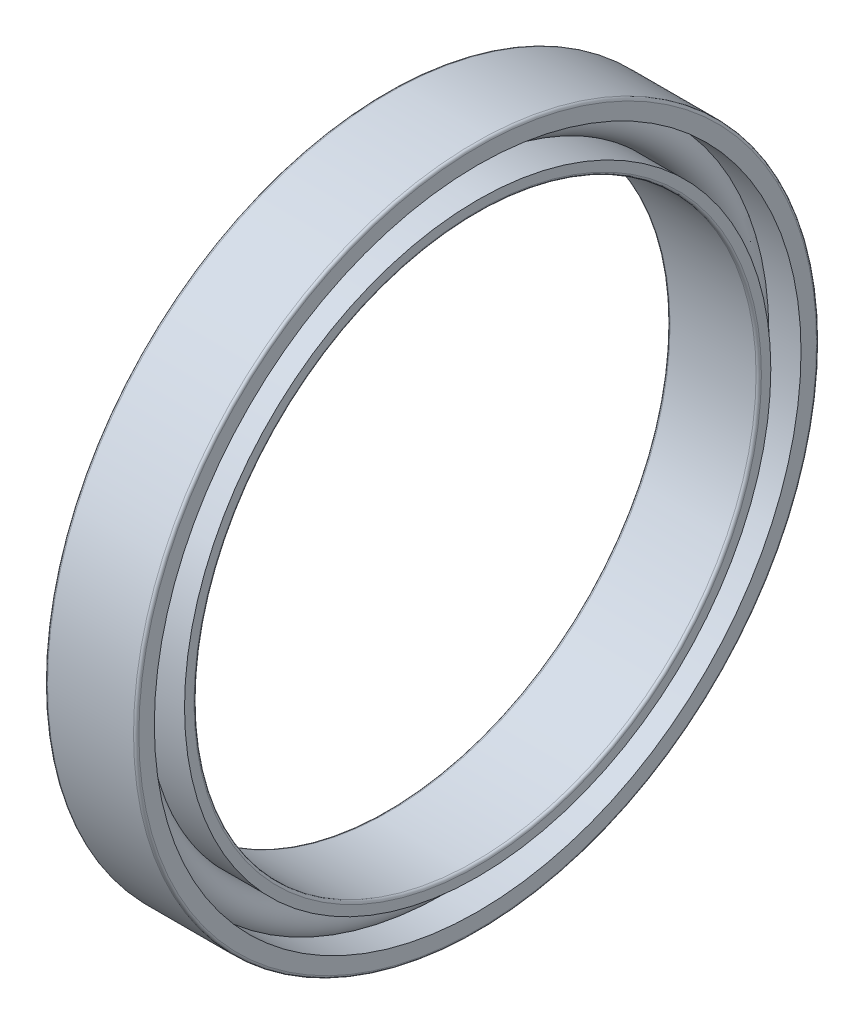
ISO-10303-21;
HEADER;
FILE_DESCRIPTION(('STEP AP214'),'2;1');
FILE_NAME('part.step','',(''),(''),'','','');
FILE_SCHEMA(('AUTOMOTIVE_DESIGN { 1 0 10303 214 1 1 1 1 }'));
ENDSEC;
DATA;
#1=APPLICATION_CONTEXT('core data for automotive mechanical design processes');
#2=APPLICATION_PROTOCOL_DEFINITION('international standard','automotive_design',2000,#1);
#3=PRODUCT_CONTEXT('',#1,'mechanical');
#4=PRODUCT('Part','Part','',(#3));
#5=PRODUCT_RELATED_PRODUCT_CATEGORY('part','',(#4));
#6=PRODUCT_DEFINITION_FORMATION('','',#4);
#7=PRODUCT_DEFINITION_CONTEXT('part definition',#1,'design');
#8=PRODUCT_DEFINITION('design','',#6,#7);
#9=PRODUCT_DEFINITION_SHAPE('','',#8);
#10=(LENGTH_UNIT() NAMED_UNIT(*) SI_UNIT(.MILLI.,.METRE.));
#11=(NAMED_UNIT(*) PLANE_ANGLE_UNIT() SI_UNIT($,.RADIAN.));
#12=(NAMED_UNIT(*) SI_UNIT($,.STERADIAN.) SOLID_ANGLE_UNIT());
#13=UNCERTAINTY_MEASURE_WITH_UNIT(LENGTH_MEASURE(1.E-05),#10,'distance_accuracy_value','');
#14=(GEOMETRIC_REPRESENTATION_CONTEXT(3) GLOBAL_UNCERTAINTY_ASSIGNED_CONTEXT((#13)) GLOBAL_UNIT_ASSIGNED_CONTEXT((#10,
#11,#12)) REPRESENTATION_CONTEXT('',''));
#15=CARTESIAN_POINT('',(0.,0.,0.));
#16=DIRECTION('',(0.,0.,1.));
#17=DIRECTION('',(1.,0.,0.));
#18=AXIS2_PLACEMENT_3D('',#15,#16,#17);
#19=CARTESIAN_POINT('',(0.,0.,0.));
#20=DIRECTION('',(-1.,0.,0.));
#21=DIRECTION('',(0.,0.,1.));
#22=AXIS2_PLACEMENT_3D('',#19,#20,#21);
#23=TOROIDAL_SURFACE('',#22,1107.5,64.5);
#24=CARTESIAN_POINT('',(48.0754615162453,0.,0.));
#25=DIRECTION('',(-1.,0.,0.));
#26=DIRECTION('',(0.,0.,1.));
#27=AXIS2_PLACEMENT_3D('',#24,#25,#26);
#28=CIRCLE('',#27,1150.5);
#29=CARTESIAN_POINT('',(48.0754615162453,0.,1150.5));
#30=VERTEX_POINT('',#29);
#31=EDGE_CURVE('E45',#30,#30,#28,.F.);
#32=ORIENTED_EDGE('',*,*,#31,.T.);
#33=EDGE_LOOP('',(#32));
#34=FACE_BOUND('',#33,.T.);
#35=CARTESIAN_POINT('',(1.79565447679094,0.,0.));
#36=DIRECTION('',(-1.,0.,0.));
#37=DIRECTION('',(0.,0.,1.));
#38=AXIS2_PLACEMENT_3D('',#35,#36,#37);
#39=CIRCLE('',#38,1043.025);
#40=CARTESIAN_POINT('',(1.79565447679094,0.,1043.025));
#41=VERTEX_POINT('',#40);
#42=EDGE_CURVE('E10',#41,#41,#39,.T.);
#43=ORIENTED_EDGE('',*,*,#42,.T.);
#44=EDGE_LOOP('',(#43));
#45=FACE_BOUND('',#44,.T.);
#46=ADVANCED_FACE('F41',(#34,#45),#23,.T.);
#47=CARTESIAN_POINT('',(-20.6375,0.,0.));
#48=DIRECTION('',(1.,0.,0.));
#49=DIRECTION('',(0.,0.,-1.));
#50=AXIS2_PLACEMENT_3D('',#47,#48,#49);
#51=CYLINDRICAL_SURFACE('',#50,1043.025);
#52=CARTESIAN_POINT('',(162.5,0.,0.));
#53=DIRECTION('',(1.,0.,0.));
#54=DIRECTION('',(0.,0.,-1.));
#55=AXIS2_PLACEMENT_3D('',#52,#53,#54);
#56=CIRCLE('',#55,1043.025);
#57=CARTESIAN_POINT('',(162.5,0.,-1043.025));
#58=VERTEX_POINT('',#57);
#59=EDGE_CURVE('E56',#58,#58,#56,.T.);
#60=ORIENTED_EDGE('',*,*,#59,.F.);
#61=EDGE_LOOP('',(#60));
#62=FACE_BOUND('',#61,.T.);
#63=ORIENTED_EDGE('',*,*,#42,.F.);
#64=EDGE_LOOP('',(#63));
#65=FACE_BOUND('',#64,.T.);
#66=ADVANCED_FACE('F105',(#62,#65),#51,.T.);
#67=CARTESIAN_POINT('',(-20.6375,0.,0.));
#68=DIRECTION('',(1.,0.,0.));
#69=DIRECTION('',(0.,0.,-1.));
#70=AXIS2_PLACEMENT_3D('',#67,#68,#69);
#71=CYLINDRICAL_SURFACE('',#70,1064.5);
#72=CARTESIAN_POINT('',(-162.5,0.,0.));
#73=DIRECTION('',(1.,0.,0.));
#74=DIRECTION('',(0.,0.,-1.));
#75=AXIS2_PLACEMENT_3D('',#72,#73,#74);
#76=CIRCLE('',#75,1064.5);
#77=CARTESIAN_POINT('',(-162.5,0.,-1064.5));
#78=VERTEX_POINT('',#77);
#79=EDGE_CURVE('E68',#78,#78,#76,.T.);
#80=ORIENTED_EDGE('',*,*,#79,.T.);
#81=EDGE_LOOP('',(#80));
#82=FACE_BOUND('',#81,.T.);
#83=CARTESIAN_POINT('',(-48.0754615162457,0.,0.));
#84=DIRECTION('',(1.,0.,0.));
#85=DIRECTION('',(0.,0.,-1.));
#86=AXIS2_PLACEMENT_3D('',#83,#84,#85);
#87=CIRCLE('',#86,1064.5);
#88=CARTESIAN_POINT('',(-48.0754615162457,0.,-1064.5));
#89=VERTEX_POINT('',#88);
#90=EDGE_CURVE('E50',#89,#89,#87,.T.);
#91=ORIENTED_EDGE('',*,*,#90,.F.);
#92=EDGE_LOOP('',(#91));
#93=FACE_BOUND('',#92,.T.);
#94=ADVANCED_FACE('F108',(#82,#93),#71,.T.);
#95=CARTESIAN_POINT('',(162.5,1009.5,0.));
#96=DIRECTION('',(1.,0.,0.));
#97=DIRECTION('',(0.,0.,-1.));
#98=AXIS2_PLACEMENT_3D('',#95,#96,#97);
#99=PLANE('',#98);
#100=ORIENTED_EDGE('',*,*,#59,.T.);
#101=EDGE_LOOP('',(#100));
#102=FACE_BOUND('',#101,.T.);
#103=CARTESIAN_POINT('',(162.5,0.,0.));
#104=DIRECTION('',(1.,0.,0.));
#105=DIRECTION('',(0.,0.,-1.));
#106=AXIS2_PLACEMENT_3D('',#103,#104,#105);
#107=CIRCLE('',#106,1009.5);
#108=CARTESIAN_POINT('',(162.5,0.,-1009.5));
#109=VERTEX_POINT('',#108);
#110=EDGE_CURVE('E95',#109,#109,#107,.T.);
#111=ORIENTED_EDGE('',*,*,#110,.F.);
#112=EDGE_LOOP('',(#111));
#113=FACE_BOUND('',#112,.T.);
#114=ADVANCED_FACE('F102',(#102,#113),#99,.T.);
#115=CARTESIAN_POINT('',(153.,0.,0.));
#116=DIRECTION('',(1.,0.,0.));
#117=DIRECTION('',(0.,0.,-1.));
#118=AXIS2_PLACEMENT_3D('',#115,#116,#117);
#119=TOROIDAL_SURFACE('',#118,1009.5,9.50000000000005);
#120=ORIENTED_EDGE('',*,*,#110,.T.);
#121=EDGE_LOOP('',(#120));
#122=FACE_BOUND('',#121,.T.);
#123=CARTESIAN_POINT('',(153.,0.,0.));
#124=DIRECTION('',(1.,0.,0.));
#125=DIRECTION('',(0.,0.,-1.));
#126=AXIS2_PLACEMENT_3D('',#123,#124,#125);
#127=CIRCLE('',#126,1000.);
#128=CARTESIAN_POINT('',(153.,0.,-1000.));
#129=VERTEX_POINT('',#128);
#130=EDGE_CURVE('E91',#129,#129,#127,.T.);
#131=ORIENTED_EDGE('',*,*,#130,.F.);
#132=EDGE_LOOP('',(#131));
#133=FACE_BOUND('',#132,.T.);
#134=ADVANCED_FACE('F119',(#122,#133),#119,.T.);
#135=CARTESIAN_POINT('',(-20.6375,0.,0.));
#136=DIRECTION('',(1.,0.,0.));
#137=DIRECTION('',(0.,0.,-1.));
#138=AXIS2_PLACEMENT_3D('',#135,#136,#137);
#139=CYLINDRICAL_SURFACE('',#138,1000.);
#140=ORIENTED_EDGE('',*,*,#130,.T.);
#141=EDGE_LOOP('',(#140));
#142=FACE_BOUND('',#141,.T.);
#143=CARTESIAN_POINT('',(-153.,0.,0.));
#144=DIRECTION('',(1.,0.,0.));
#145=DIRECTION('',(0.,0.,-1.));
#146=AXIS2_PLACEMENT_3D('',#143,#144,#145);
#147=CIRCLE('',#146,1000.);
#148=CARTESIAN_POINT('',(-153.,0.,-1000.));
#149=VERTEX_POINT('',#148);
#150=EDGE_CURVE('E87',#149,#149,#147,.T.);
#151=ORIENTED_EDGE('',*,*,#150,.F.);
#152=EDGE_LOOP('',(#151));
#153=FACE_BOUND('',#152,.T.);
#154=ADVANCED_FACE('F122',(#142,#153),#139,.F.);
#155=CARTESIAN_POINT('',(-153.,0.,0.));
#156=DIRECTION('',(1.,0.,0.));
#157=DIRECTION('',(0.,0.,-1.));
#158=AXIS2_PLACEMENT_3D('',#155,#156,#157);
#159=TOROIDAL_SURFACE('',#158,1009.5,9.50000000000005);
#160=ORIENTED_EDGE('',*,*,#150,.T.);
#161=EDGE_LOOP('',(#160));
#162=FACE_BOUND('',#161,.T.);
#163=CARTESIAN_POINT('',(-162.5,0.,0.));
#164=DIRECTION('',(1.,0.,0.));
#165=DIRECTION('',(0.,0.,-1.));
#166=AXIS2_PLACEMENT_3D('',#163,#164,#165);
#167=CIRCLE('',#166,1009.5);
#168=CARTESIAN_POINT('',(-162.5,0.,-1009.5));
#169=VERTEX_POINT('',#168);
#170=EDGE_CURVE('E83',#169,#169,#167,.T.);
#171=ORIENTED_EDGE('',*,*,#170,.F.);
#172=EDGE_LOOP('',(#171));
#173=FACE_BOUND('',#172,.T.);
#174=ADVANCED_FACE('F126',(#162,#173),#159,.T.);
#175=CARTESIAN_POINT('',(-162.5,1064.5,0.));
#176=DIRECTION('',(-1.,0.,0.));
#177=DIRECTION('',(0.,0.,1.));
#178=AXIS2_PLACEMENT_3D('',#175,#176,#177);
#179=PLANE('',#178);
#180=ORIENTED_EDGE('',*,*,#170,.T.);
#181=EDGE_LOOP('',(#180));
#182=FACE_BOUND('',#181,.T.);
#183=ORIENTED_EDGE('',*,*,#79,.F.);
#184=EDGE_LOOP('',(#183));
#185=FACE_BOUND('',#184,.T.);
#186=ADVANCED_FACE('F130',(#182,#185),#179,.T.);
#187=CARTESIAN_POINT('',(-1.79565447679094,0.,0.));
#188=DIRECTION('',(1.,0.,0.));
#189=DIRECTION('',(0.,0.,-1.));
#190=AXIS2_PLACEMENT_3D('',#187,#188,#189);
#191=CIRCLE('',#190,1171.975);
#192=CARTESIAN_POINT('',(-1.79565447679094,0.,-1171.975));
#193=VERTEX_POINT('',#192);
#194=EDGE_CURVE('E59',#193,#193,#191,.F.);
#195=ORIENTED_EDGE('',*,*,#194,.T.);
#196=EDGE_LOOP('',(#195));
#197=FACE_BOUND('',#196,.T.);
#198=ORIENTED_EDGE('',*,*,#90,.T.);
#199=EDGE_LOOP('',(#198));
#200=FACE_BOUND('',#199,.T.);
#201=ADVANCED_FACE('F43',(#197,#200),#23,.T.);
#202=CARTESIAN_POINT('',(-20.6375,0.,0.));
#203=DIRECTION('',(1.,0.,0.));
#204=DIRECTION('',(0.,0.,-1.));
#205=AXIS2_PLACEMENT_3D('',#202,#203,#204);
#206=CYLINDRICAL_SURFACE('',#205,1150.5);
#207=CARTESIAN_POINT('',(162.5,0.,0.));
#208=DIRECTION('',(1.,0.,0.));
#209=DIRECTION('',(0.,0.,-1.));
#210=AXIS2_PLACEMENT_3D('',#207,#208,#209);
#211=CIRCLE('',#210,1150.5);
#212=CARTESIAN_POINT('',(162.5,0.,-1150.5));
#213=VERTEX_POINT('',#212);
#214=EDGE_CURVE('E173',#213,#213,#211,.T.);
#215=ORIENTED_EDGE('',*,*,#214,.T.);
#216=EDGE_LOOP('',(#215));
#217=FACE_BOUND('',#216,.T.);
#218=ORIENTED_EDGE('',*,*,#31,.F.);
#219=EDGE_LOOP('',(#218));
#220=FACE_BOUND('',#219,.T.);
#221=ADVANCED_FACE('F152',(#217,#220),#206,.F.);
#222=CARTESIAN_POINT('',(-20.6375,0.,0.));
#223=DIRECTION('',(1.,0.,0.));
#224=DIRECTION('',(0.,0.,-1.));
#225=AXIS2_PLACEMENT_3D('',#222,#223,#224);
#226=CYLINDRICAL_SURFACE('',#225,1171.975);
#227=CARTESIAN_POINT('',(-162.5,0.,0.));
#228=DIRECTION('',(1.,0.,0.));
#229=DIRECTION('',(0.,0.,-1.));
#230=AXIS2_PLACEMENT_3D('',#227,#228,#229);
#231=CIRCLE('',#230,1171.975);
#232=CARTESIAN_POINT('',(-162.5,0.,-1171.975));
#233=VERTEX_POINT('',#232);
#234=EDGE_CURVE('E166',#233,#233,#231,.T.);
#235=ORIENTED_EDGE('',*,*,#234,.F.);
#236=EDGE_LOOP('',(#235));
#237=FACE_BOUND('',#236,.T.);
#238=ORIENTED_EDGE('',*,*,#194,.F.);
#239=EDGE_LOOP('',(#238));
#240=FACE_BOUND('',#239,.T.);
#241=ADVANCED_FACE('F139',(#237,#240),#226,.F.);
#242=CARTESIAN_POINT('',(-153.,0.,0.));
#243=DIRECTION('',(1.,0.,0.));
#244=DIRECTION('',(0.,0.,-1.));
#245=AXIS2_PLACEMENT_3D('',#242,#243,#244);
#246=TOROIDAL_SURFACE('',#245,1205.5,9.49999999999981);
#247=CARTESIAN_POINT('',(-162.5,0.,0.));
#248=DIRECTION('',(1.,0.,0.));
#249=DIRECTION('',(0.,0.,-1.));
#250=AXIS2_PLACEMENT_3D('',#247,#248,#249);
#251=CIRCLE('',#250,1205.5);
#252=CARTESIAN_POINT('',(-162.5,0.,-1205.5));
#253=VERTEX_POINT('',#252);
#254=EDGE_CURVE('E169',#253,#253,#251,.T.);
#255=ORIENTED_EDGE('',*,*,#254,.T.);
#256=EDGE_LOOP('',(#255));
#257=FACE_BOUND('',#256,.T.);
#258=CARTESIAN_POINT('',(-153.,0.,0.));
#259=DIRECTION('',(1.,0.,0.));
#260=DIRECTION('',(0.,0.,-1.));
#261=AXIS2_PLACEMENT_3D('',#258,#259,#260);
#262=CIRCLE('',#261,1215.);
#263=CARTESIAN_POINT('',(-153.,0.,-1215.));
#264=VERTEX_POINT('',#263);
#265=EDGE_CURVE('E62',#264,#264,#262,.T.);
#266=ORIENTED_EDGE('',*,*,#265,.F.);
#267=EDGE_LOOP('',(#266));
#268=FACE_BOUND('',#267,.T.);
#269=ADVANCED_FACE('F135',(#257,#268),#246,.T.);
#270=CARTESIAN_POINT('',(-20.6375,0.,0.));
#271=DIRECTION('',(1.,0.,0.));
#272=DIRECTION('',(0.,0.,-1.));
#273=AXIS2_PLACEMENT_3D('',#270,#271,#272);
#274=CYLINDRICAL_SURFACE('',#273,1215.);
#275=ORIENTED_EDGE('',*,*,#265,.T.);
#276=EDGE_LOOP('',(#275));
#277=FACE_BOUND('',#276,.T.);
#278=CARTESIAN_POINT('',(153.,0.,0.));
#279=DIRECTION('',(1.,0.,0.));
#280=DIRECTION('',(0.,0.,-1.));
#281=AXIS2_PLACEMENT_3D('',#278,#279,#280);
#282=CIRCLE('',#281,1215.);
#283=CARTESIAN_POINT('',(153.,0.,-1215.));
#284=VERTEX_POINT('',#283);
#285=EDGE_CURVE('E70',#284,#284,#282,.T.);
#286=ORIENTED_EDGE('',*,*,#285,.F.);
#287=EDGE_LOOP('',(#286));
#288=FACE_BOUND('',#287,.T.);
#289=ADVANCED_FACE('F138',(#277,#288),#274,.T.);
#290=CARTESIAN_POINT('',(153.,0.,0.));
#291=DIRECTION('',(1.,0.,0.));
#292=DIRECTION('',(0.,0.,-1.));
#293=AXIS2_PLACEMENT_3D('',#290,#291,#292);
#294=TOROIDAL_SURFACE('',#293,1205.5,9.49999999999981);
#295=ORIENTED_EDGE('',*,*,#285,.T.);
#296=EDGE_LOOP('',(#295));
#297=FACE_BOUND('',#296,.T.);
#298=CARTESIAN_POINT('',(162.5,0.,0.));
#299=DIRECTION('',(1.,0.,0.));
#300=DIRECTION('',(0.,0.,-1.));
#301=AXIS2_PLACEMENT_3D('',#298,#299,#300);
#302=CIRCLE('',#301,1205.5);
#303=CARTESIAN_POINT('',(162.5,0.,-1205.5));
#304=VERTEX_POINT('',#303);
#305=EDGE_CURVE('E76',#304,#304,#302,.T.);
#306=ORIENTED_EDGE('',*,*,#305,.F.);
#307=EDGE_LOOP('',(#306));
#308=FACE_BOUND('',#307,.T.);
#309=ADVANCED_FACE('F143',(#297,#308),#294,.T.);
#310=CARTESIAN_POINT('',(162.5,1205.5,0.));
#311=DIRECTION('',(1.,0.,0.));
#312=DIRECTION('',(0.,0.,-1.));
#313=AXIS2_PLACEMENT_3D('',#310,#311,#312);
#314=PLANE('',#313);
#315=ORIENTED_EDGE('',*,*,#305,.T.);
#316=EDGE_LOOP('',(#315));
#317=FACE_BOUND('',#316,.T.);
#318=ORIENTED_EDGE('',*,*,#214,.F.);
#319=EDGE_LOOP('',(#318));
#320=FACE_BOUND('',#319,.T.);
#321=ADVANCED_FACE('F146',(#317,#320),#314,.T.);
#322=CARTESIAN_POINT('',(-162.5,1171.975,0.));
#323=DIRECTION('',(-1.,0.,0.));
#324=DIRECTION('',(0.,0.,1.));
#325=AXIS2_PLACEMENT_3D('',#322,#323,#324);
#326=PLANE('',#325);
#327=ORIENTED_EDGE('',*,*,#234,.T.);
#328=EDGE_LOOP('',(#327));
#329=FACE_BOUND('',#328,.T.);
#330=ORIENTED_EDGE('',*,*,#254,.F.);
#331=EDGE_LOOP('',(#330));
#332=FACE_BOUND('',#331,.T.);
#333=ADVANCED_FACE('F150',(#329,#332),#326,.T.);
#334=CLOSED_SHELL('',(#46,#66,#94,#114,#134,#154,#174,#186,#201,#221,#241,#269,#289,#309,#321,#333));
#335=MANIFOLD_SOLID_BREP('B2',#334);
#336=ADVANCED_BREP_SHAPE_REPRESENTATION('',(#18,#335),#14);
#337=SHAPE_DEFINITION_REPRESENTATION(#9,#336);
ENDSEC;
END-ISO-10303-21;
